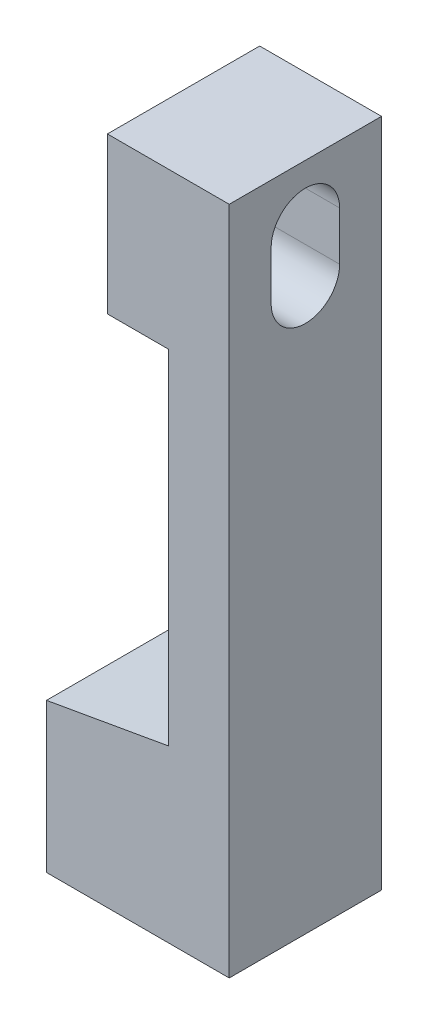
ISO-10303-21;
HEADER;
FILE_DESCRIPTION(('STEP AP214'),'2;1');
FILE_NAME('part.step','',(''),(''),'','','');
FILE_SCHEMA(('AUTOMOTIVE_DESIGN { 1 0 10303 214 1 1 1 1 }'));
ENDSEC;
DATA;
#1=APPLICATION_CONTEXT('core data for automotive mechanical design processes');
#2=APPLICATION_PROTOCOL_DEFINITION('international standard','automotive_design',2000,#1);
#3=PRODUCT_CONTEXT('',#1,'mechanical');
#4=PRODUCT('Part','Part','',(#3));
#5=PRODUCT_RELATED_PRODUCT_CATEGORY('part','',(#4));
#6=PRODUCT_DEFINITION_FORMATION('','',#4);
#7=PRODUCT_DEFINITION_CONTEXT('part definition',#1,'design');
#8=PRODUCT_DEFINITION('design','',#6,#7);
#9=PRODUCT_DEFINITION_SHAPE('','',#8);
#10=(LENGTH_UNIT() NAMED_UNIT(*) SI_UNIT(.MILLI.,.METRE.));
#11=(NAMED_UNIT(*) PLANE_ANGLE_UNIT() SI_UNIT($,.RADIAN.));
#12=(NAMED_UNIT(*) SI_UNIT($,.STERADIAN.) SOLID_ANGLE_UNIT());
#13=UNCERTAINTY_MEASURE_WITH_UNIT(LENGTH_MEASURE(1.E-05),#10,'distance_accuracy_value','');
#14=(GEOMETRIC_REPRESENTATION_CONTEXT(3) GLOBAL_UNCERTAINTY_ASSIGNED_CONTEXT((#13)) GLOBAL_UNIT_ASSIGNED_CONTEXT((#10,
#11,#12)) REPRESENTATION_CONTEXT('',''));
#15=CARTESIAN_POINT('',(0.,0.,0.));
#16=DIRECTION('',(0.,0.,1.));
#17=DIRECTION('',(1.,0.,0.));
#18=AXIS2_PLACEMENT_3D('',#15,#16,#17);
#19=CARTESIAN_POINT('',(0.,0.,0.));
#20=DIRECTION('',(1.,0.,0.));
#21=DIRECTION('',(0.,0.,-1.));
#22=AXIS2_PLACEMENT_3D('',#19,#20,#21);
#23=PLANE('',#22);
#24=DIRECTION('',(0.,0.173648177666927,0.984807753012208));
#25=VECTOR('',#24,1.);
#26=CARTESIAN_POINT('',(0.,15.875,-7.93750000000001));
#27=LINE('',#26,#25);
#28=CARTESIAN_POINT('',(0.,15.875,-7.9375));
#29=VERTEX_POINT('',#28);
#30=CARTESIAN_POINT('',(0.,18.6741908187468,7.93750000000001));
#31=VERTEX_POINT('',#30);
#32=EDGE_CURVE('E182',#29,#31,#27,.T.);
#33=ORIENTED_EDGE('',*,*,#32,.F.);
#34=DIRECTION('',(0.,1.,0.));
#35=VECTOR('',#34,1.);
#36=CARTESIAN_POINT('',(0.,34.925,-7.93749999999999));
#37=LINE('',#36,#35);
#38=CARTESIAN_POINT('',(0.,-19.9441908187469,-7.9375));
#39=VERTEX_POINT('',#38);
#40=EDGE_CURVE('E201',#39,#29,#37,.T.);
#41=ORIENTED_EDGE('',*,*,#40,.F.);
#42=DIRECTION('',(0.,-0.173648177666934,-0.984807753012207));
#43=VECTOR('',#42,1.);
#44=CARTESIAN_POINT('',(0.,-17.145,7.93750000000001));
#45=LINE('',#44,#43);
#46=CARTESIAN_POINT('',(0.,-17.145,7.93750000000001));
#47=VERTEX_POINT('',#46);
#48=EDGE_CURVE('E166',#47,#39,#45,.T.);
#49=ORIENTED_EDGE('',*,*,#48,.F.);
#50=DIRECTION('',(0.,-1.,0.));
#51=VECTOR('',#50,1.);
#52=CARTESIAN_POINT('',(0.,34.925,7.93750000000001));
#53=LINE('',#52,#51);
#54=EDGE_CURVE('E206',#31,#47,#53,.T.);
#55=ORIENTED_EDGE('',*,*,#54,.F.);
#56=EDGE_LOOP('',(#33,#41,#49,#55));
#57=FACE_BOUND('',#56,.T.);
#58=ADVANCED_FACE('F37',(#57),#23,.F.);
#59=CARTESIAN_POINT('',(6.35,34.925,-7.93749999999999));
#60=DIRECTION('',(0.,0.,1.));
#61=DIRECTION('',(0.,-1.,0.));
#62=AXIS2_PLACEMENT_3D('',#59,#60,#61);
#63=PLANE('',#62);
#64=DIRECTION('',(-1.,0.,0.));
#65=VECTOR('',#64,1.);
#66=CARTESIAN_POINT('',(6.35,-34.925,-7.9375));
#67=LINE('',#66,#65);
#68=CARTESIAN_POINT('',(6.35,-34.925,-7.9375));
#69=VERTEX_POINT('',#68);
#70=CARTESIAN_POINT('',(-12.7,-34.925,-7.9375));
#71=VERTEX_POINT('',#70);
#72=EDGE_CURVE('E212',#69,#71,#67,.T.);
#73=ORIENTED_EDGE('',*,*,#72,.T.);
#74=DIRECTION('',(0.,-1.,0.));
#75=VECTOR('',#74,1.);
#76=CARTESIAN_POINT('',(-12.7,-19.9441908187469,-7.9375));
#77=LINE('',#76,#75);
#78=CARTESIAN_POINT('',(-12.7,-19.9441908187469,-7.9375));
#79=VERTEX_POINT('',#78);
#80=EDGE_CURVE('E169',#79,#71,#77,.T.);
#81=ORIENTED_EDGE('',*,*,#80,.F.);
#82=DIRECTION('',(1.,0.,0.));
#83=VECTOR('',#82,1.);
#84=CARTESIAN_POINT('',(-12.7,-19.9441908187469,-7.9375));
#85=LINE('',#84,#83);
#86=EDGE_CURVE('E178',#79,#39,#85,.T.);
#87=ORIENTED_EDGE('',*,*,#86,.T.);
#88=ORIENTED_EDGE('',*,*,#40,.T.);
#89=DIRECTION('',(1.,0.,0.));
#90=VECTOR('',#89,1.);
#91=CARTESIAN_POINT('',(-6.35,15.875,-7.93750000000001));
#92=LINE('',#91,#90);
#93=CARTESIAN_POINT('',(-6.35,15.875,-7.93750000000001));
#94=VERTEX_POINT('',#93);
#95=EDGE_CURVE('E198',#94,#29,#92,.T.);
#96=ORIENTED_EDGE('',*,*,#95,.F.);
#97=DIRECTION('',(0.,-1.,0.));
#98=VECTOR('',#97,1.);
#99=CARTESIAN_POINT('',(-6.35,34.925,-7.9375));
#100=LINE('',#99,#98);
#101=CARTESIAN_POINT('',(-6.35,34.925,-7.9375));
#102=VERTEX_POINT('',#101);
#103=EDGE_CURVE('E189',#102,#94,#100,.T.);
#104=ORIENTED_EDGE('',*,*,#103,.F.);
#105=DIRECTION('',(-1.,0.,0.));
#106=VECTOR('',#105,1.);
#107=CARTESIAN_POINT('',(6.35,34.925,-7.93749999999999));
#108=LINE('',#107,#106);
#109=CARTESIAN_POINT('',(6.35,34.925,-7.93749999999999));
#110=VERTEX_POINT('',#109);
#111=EDGE_CURVE('E221',#110,#102,#108,.T.);
#112=ORIENTED_EDGE('',*,*,#111,.F.);
#113=DIRECTION('',(0.,1.,0.));
#114=VECTOR('',#113,1.);
#115=CARTESIAN_POINT('',(6.35,34.925,-7.93749999999999));
#116=LINE('',#115,#114);
#117=EDGE_CURVE('E202',#69,#110,#116,.T.);
#118=ORIENTED_EDGE('',*,*,#117,.F.);
#119=EDGE_LOOP('',(#73,#81,#87,#88,#96,#104,#112,#118));
#120=FACE_BOUND('',#119,.T.);
#121=ADVANCED_FACE('F39',(#120),#63,.F.);
#122=CARTESIAN_POINT('',(6.35,34.925,7.93750000000001));
#123=DIRECTION('',(0.,-1.,0.));
#124=DIRECTION('',(0.,0.,-1.));
#125=AXIS2_PLACEMENT_3D('',#122,#123,#124);
#126=PLANE('',#125);
#127=ORIENTED_EDGE('',*,*,#111,.T.);
#128=DIRECTION('',(0.,0.,-1.));
#129=VECTOR('',#128,1.);
#130=CARTESIAN_POINT('',(-6.35,34.925,7.93750000000001));
#131=LINE('',#130,#129);
#132=CARTESIAN_POINT('',(-6.35,34.925,7.93750000000001));
#133=VERTEX_POINT('',#132);
#134=EDGE_CURVE('E186',#133,#102,#131,.T.);
#135=ORIENTED_EDGE('',*,*,#134,.F.);
#136=DIRECTION('',(-1.,0.,0.));
#137=VECTOR('',#136,1.);
#138=CARTESIAN_POINT('',(6.35,34.925,7.93750000000001));
#139=LINE('',#138,#137);
#140=CARTESIAN_POINT('',(6.35,34.925,7.93750000000001));
#141=VERTEX_POINT('',#140);
#142=EDGE_CURVE('E219',#141,#133,#139,.T.);
#143=ORIENTED_EDGE('',*,*,#142,.F.);
#144=DIRECTION('',(0.,0.,1.));
#145=VECTOR('',#144,1.);
#146=CARTESIAN_POINT('',(6.35,34.925,7.93750000000001));
#147=LINE('',#146,#145);
#148=EDGE_CURVE('E205',#110,#141,#147,.T.);
#149=ORIENTED_EDGE('',*,*,#148,.F.);
#150=EDGE_LOOP('',(#127,#135,#143,#149));
#151=FACE_BOUND('',#150,.T.);
#152=ADVANCED_FACE('F251',(#151),#126,.F.);
#153=CARTESIAN_POINT('',(6.35,34.925,7.93750000000001));
#154=DIRECTION('',(0.,0.,-1.));
#155=DIRECTION('',(0.,1.,0.));
#156=AXIS2_PLACEMENT_3D('',#153,#154,#155);
#157=PLANE('',#156);
#158=ORIENTED_EDGE('',*,*,#54,.T.);
#159=DIRECTION('',(-0.984807753012209,-0.173648177666923,0.));
#160=VECTOR('',#159,1.);
#161=CARTESIAN_POINT('',(-12.7,-19.3843526549974,7.93750000000001));
#162=LINE('',#161,#160);
#163=CARTESIAN_POINT('',(-12.7,-19.3843526549974,7.93750000000001));
#164=VERTEX_POINT('',#163);
#165=EDGE_CURVE('E155',#47,#164,#162,.T.);
#166=ORIENTED_EDGE('',*,*,#165,.T.);
#167=DIRECTION('',(0.,1.,0.));
#168=VECTOR('',#167,1.);
#169=CARTESIAN_POINT('',(-12.7,-34.925,7.9375));
#170=LINE('',#169,#168);
#171=CARTESIAN_POINT('',(-12.7,-34.925,7.9375));
#172=VERTEX_POINT('',#171);
#173=EDGE_CURVE('E175',#172,#164,#170,.T.);
#174=ORIENTED_EDGE('',*,*,#173,.F.);
#175=DIRECTION('',(-1.,0.,0.));
#176=VECTOR('',#175,1.);
#177=CARTESIAN_POINT('',(6.35,-34.925,7.9375));
#178=LINE('',#177,#176);
#179=CARTESIAN_POINT('',(6.35,-34.925,7.9375));
#180=VERTEX_POINT('',#179);
#181=EDGE_CURVE('E217',#180,#172,#178,.T.);
#182=ORIENTED_EDGE('',*,*,#181,.F.);
#183=DIRECTION('',(0.,-1.,0.));
#184=VECTOR('',#183,1.);
#185=CARTESIAN_POINT('',(6.35,34.925,7.93750000000001));
#186=LINE('',#185,#184);
#187=EDGE_CURVE('E208',#141,#180,#186,.T.);
#188=ORIENTED_EDGE('',*,*,#187,.F.);
#189=ORIENTED_EDGE('',*,*,#142,.T.);
#190=DIRECTION('',(0.,1.,0.));
#191=VECTOR('',#190,1.);
#192=CARTESIAN_POINT('',(-6.35,34.925,7.93750000000001));
#193=LINE('',#192,#191);
#194=CARTESIAN_POINT('',(-6.35,18.6741908187468,7.93750000000001));
#195=VERTEX_POINT('',#194);
#196=EDGE_CURVE('E183',#195,#133,#193,.T.);
#197=ORIENTED_EDGE('',*,*,#196,.F.);
#198=DIRECTION('',(1.,0.,0.));
#199=VECTOR('',#198,1.);
#200=CARTESIAN_POINT('',(-6.35,18.6741908187468,7.93750000000001));
#201=LINE('',#200,#199);
#202=EDGE_CURVE('E193',#195,#31,#201,.T.);
#203=ORIENTED_EDGE('',*,*,#202,.T.);
#204=EDGE_LOOP('',(#158,#166,#174,#182,#188,#189,#197,#203));
#205=FACE_BOUND('',#204,.T.);
#206=ADVANCED_FACE('F260',(#205),#157,.F.);
#207=CARTESIAN_POINT('',(6.35,-34.925,7.9375));
#208=DIRECTION('',(0.,1.,0.));
#209=DIRECTION('',(0.,0.,1.));
#210=AXIS2_PLACEMENT_3D('',#207,#208,#209);
#211=PLANE('',#210);
#212=ORIENTED_EDGE('',*,*,#181,.T.);
#213=DIRECTION('',(0.,0.,1.));
#214=VECTOR('',#213,1.);
#215=CARTESIAN_POINT('',(-12.7,-34.925,-7.9375));
#216=LINE('',#215,#214);
#217=EDGE_CURVE('E172',#71,#172,#216,.T.);
#218=ORIENTED_EDGE('',*,*,#217,.F.);
#219=ORIENTED_EDGE('',*,*,#72,.F.);
#220=DIRECTION('',(0.,0.,-1.));
#221=VECTOR('',#220,1.);
#222=CARTESIAN_POINT('',(6.35,-34.925,7.9375));
#223=LINE('',#222,#221);
#224=EDGE_CURVE('E210',#180,#69,#223,.T.);
#225=ORIENTED_EDGE('',*,*,#224,.F.);
#226=EDGE_LOOP('',(#212,#218,#219,#225));
#227=FACE_BOUND('',#226,.T.);
#228=ADVANCED_FACE('F257',(#227),#211,.F.);
#229=CARTESIAN_POINT('',(6.35,0.,0.));
#230=DIRECTION('',(1.,0.,0.));
#231=DIRECTION('',(0.,0.,-1.));
#232=AXIS2_PLACEMENT_3D('',#229,#230,#231);
#233=PLANE('',#232);
#234=CARTESIAN_POINT('',(6.35,28.8417379890377,0.));
#235=DIRECTION('',(1.,0.,0.));
#236=DIRECTION('',(0.,0.,-1.));
#237=AXIS2_PLACEMENT_3D('',#234,#235,#236);
#238=CIRCLE('',#237,3.5687);
#239=CARTESIAN_POINT('',(6.35,28.8417379890377,-3.5687));
#240=VERTEX_POINT('',#239);
#241=CARTESIAN_POINT('',(6.35,28.8417379890377,3.5687));
#242=VERTEX_POINT('',#241);
#243=EDGE_CURVE('E52',#240,#242,#238,.T.);
#244=ORIENTED_EDGE('',*,*,#243,.F.);
#245=DIRECTION('',(0.,1.,0.));
#246=VECTOR('',#245,1.);
#247=CARTESIAN_POINT('',(6.35,28.8417379890377,-3.5687));
#248=LINE('',#247,#246);
#249=CARTESIAN_POINT('',(6.35,23.7617379890377,-3.5687));
#250=VERTEX_POINT('',#249);
#251=EDGE_CURVE('E148',#250,#240,#248,.T.);
#252=ORIENTED_EDGE('',*,*,#251,.F.);
#253=CARTESIAN_POINT('',(6.35,23.7617379890377,0.));
#254=DIRECTION('',(1.,0.,0.));
#255=DIRECTION('',(0.,0.,-1.));
#256=AXIS2_PLACEMENT_3D('',#253,#254,#255);
#257=CIRCLE('',#256,3.5687);
#258=CARTESIAN_POINT('',(6.35,23.7617379890377,3.5687));
#259=VERTEX_POINT('',#258);
#260=EDGE_CURVE('E132',#259,#250,#257,.T.);
#261=ORIENTED_EDGE('',*,*,#260,.F.);
#262=DIRECTION('',(0.,-1.,0.));
#263=VECTOR('',#262,1.);
#264=CARTESIAN_POINT('',(6.35,28.8417379890377,3.5687));
#265=LINE('',#264,#263);
#266=EDGE_CURVE('E141',#242,#259,#265,.T.);
#267=ORIENTED_EDGE('',*,*,#266,.F.);
#268=EDGE_LOOP('',(#244,#252,#261,#267));
#269=FACE_BOUND('',#268,.T.);
#270=ORIENTED_EDGE('',*,*,#117,.T.);
#271=ORIENTED_EDGE('',*,*,#148,.T.);
#272=ORIENTED_EDGE('',*,*,#187,.T.);
#273=ORIENTED_EDGE('',*,*,#224,.T.);
#274=EDGE_LOOP('',(#270,#271,#272,#273));
#275=FACE_BOUND('',#274,.T.);
#276=ADVANCED_FACE('F145',(#269,#275),#233,.T.);
#277=CARTESIAN_POINT('',(-6.35,15.875,-7.93750000000001));
#278=DIRECTION('',(0.,0.984807753012209,-0.173648177666927));
#279=DIRECTION('',(0.,0.173648177666927,0.984807753012209));
#280=AXIS2_PLACEMENT_3D('',#277,#278,#279);
#281=PLANE('',#280);
#282=ORIENTED_EDGE('',*,*,#32,.T.);
#283=ORIENTED_EDGE('',*,*,#202,.F.);
#284=DIRECTION('',(0.,0.173648177666927,0.984807753012208));
#285=VECTOR('',#284,1.);
#286=CARTESIAN_POINT('',(-6.35,15.875,-7.93750000000001));
#287=LINE('',#286,#285);
#288=EDGE_CURVE('E191',#94,#195,#287,.T.);
#289=ORIENTED_EDGE('',*,*,#288,.F.);
#290=ORIENTED_EDGE('',*,*,#95,.T.);
#291=EDGE_LOOP('',(#282,#283,#289,#290));
#292=FACE_BOUND('',#291,.T.);
#293=ADVANCED_FACE('F279',(#292),#281,.F.);
#294=CARTESIAN_POINT('',(-6.35,0.,0.));
#295=DIRECTION('',(1.,0.,0.));
#296=DIRECTION('',(0.,0.,-1.));
#297=AXIS2_PLACEMENT_3D('',#294,#295,#296);
#298=PLANE('',#297);
#299=DIRECTION('',(0.,1.,0.));
#300=VECTOR('',#299,1.);
#301=CARTESIAN_POINT('',(-6.35,0.,-3.56870000000001));
#302=LINE('',#301,#300);
#303=CARTESIAN_POINT('',(-6.35,23.7617379890377,-3.5687));
#304=VERTEX_POINT('',#303);
#305=CARTESIAN_POINT('',(-6.35,28.8417379890377,-3.5687));
#306=VERTEX_POINT('',#305);
#307=EDGE_CURVE('E45',#304,#306,#302,.T.);
#308=ORIENTED_EDGE('',*,*,#307,.T.);
#309=CARTESIAN_POINT('',(-6.35,28.8417379890377,0.));
#310=DIRECTION('',(1.,0.,0.));
#311=DIRECTION('',(0.,0.,-1.));
#312=AXIS2_PLACEMENT_3D('',#309,#310,#311);
#313=CIRCLE('',#312,3.5687);
#314=CARTESIAN_POINT('',(-6.35,28.8417379890377,3.5687));
#315=VERTEX_POINT('',#314);
#316=EDGE_CURVE('E11',#306,#315,#313,.T.);
#317=ORIENTED_EDGE('',*,*,#316,.T.);
#318=DIRECTION('',(0.,-1.,0.));
#319=VECTOR('',#318,1.);
#320=CARTESIAN_POINT('',(-6.35,0.,3.56869999999999));
#321=LINE('',#320,#319);
#322=CARTESIAN_POINT('',(-6.35,23.7617379890377,3.5687));
#323=VERTEX_POINT('',#322);
#324=EDGE_CURVE('E223',#315,#323,#321,.T.);
#325=ORIENTED_EDGE('',*,*,#324,.T.);
#326=CARTESIAN_POINT('',(-6.35,23.7617379890377,0.));
#327=DIRECTION('',(1.,0.,0.));
#328=DIRECTION('',(0.,0.,-1.));
#329=AXIS2_PLACEMENT_3D('',#326,#327,#328);
#330=CIRCLE('',#329,3.5687);
#331=EDGE_CURVE('E135',#323,#304,#330,.T.);
#332=ORIENTED_EDGE('',*,*,#331,.T.);
#333=EDGE_LOOP('',(#308,#317,#325,#332));
#334=FACE_BOUND('',#333,.T.);
#335=ORIENTED_EDGE('',*,*,#196,.T.);
#336=ORIENTED_EDGE('',*,*,#134,.T.);
#337=ORIENTED_EDGE('',*,*,#103,.T.);
#338=ORIENTED_EDGE('',*,*,#288,.T.);
#339=EDGE_LOOP('',(#335,#336,#337,#338));
#340=FACE_BOUND('',#339,.T.);
#341=ADVANCED_FACE('F227',(#334,#340),#298,.F.);
#342=CARTESIAN_POINT('',(-12.7,-17.145,7.93750000000001));
#343=DIRECTION('',(0.,-0.984807753012207,0.173648177666934));
#344=DIRECTION('',(0.,-0.173648177666934,-0.984807753012208));
#345=AXIS2_PLACEMENT_3D('',#342,#343,#344);
#346=PLANE('',#345);
#347=DIRECTION('',(0.,-0.173648177666934,-0.984807753012207));
#348=VECTOR('',#347,1.);
#349=CARTESIAN_POINT('',(-12.7,-17.145,7.93750000000001));
#350=LINE('',#349,#348);
#351=CARTESIAN_POINT('',(-12.7,-19.3843526549974,-4.76249999999936));
#352=VERTEX_POINT('',#351);
#353=EDGE_CURVE('E167',#352,#79,#350,.T.);
#354=ORIENTED_EDGE('',*,*,#353,.F.);
#355=DIRECTION('',(0.701673843159885,0.123724030206482,0.701673843159842));
#356=VECTOR('',#355,1.);
#357=CARTESIAN_POINT('',(-6.25279651361947,-18.2475367302309,1.68470348638089));
#358=LINE('',#357,#356);
#359=EDGE_CURVE('E163',#352,#47,#358,.T.);
#360=ORIENTED_EDGE('',*,*,#359,.T.);
#361=ORIENTED_EDGE('',*,*,#48,.T.);
#362=ORIENTED_EDGE('',*,*,#86,.F.);
#363=EDGE_LOOP('',(#354,#360,#361,#362));
#364=FACE_BOUND('',#363,.T.);
#365=ADVANCED_FACE('F291',(#364),#346,.F.);
#366=CARTESIAN_POINT('',(-12.7,0.,0.));
#367=DIRECTION('',(-1.,0.,0.));
#368=DIRECTION('',(0.,0.,1.));
#369=AXIS2_PLACEMENT_3D('',#366,#367,#368);
#370=PLANE('',#369);
#371=DIRECTION('',(0.,0.,-1.));
#372=VECTOR('',#371,1.);
#373=CARTESIAN_POINT('',(-12.7,-19.3843526549974,7.93750000000001));
#374=LINE('',#373,#372);
#375=EDGE_CURVE('E160',#164,#352,#374,.T.);
#376=ORIENTED_EDGE('',*,*,#375,.T.);
#377=ORIENTED_EDGE('',*,*,#353,.T.);
#378=ORIENTED_EDGE('',*,*,#80,.T.);
#379=ORIENTED_EDGE('',*,*,#217,.T.);
#380=ORIENTED_EDGE('',*,*,#173,.T.);
#381=EDGE_LOOP('',(#376,#377,#378,#379,#380));
#382=FACE_BOUND('',#381,.T.);
#383=ADVANCED_FACE('F241',(#382),#370,.T.);
#384=CARTESIAN_POINT('',(-12.7,-19.3843526549974,7.93750000000001));
#385=DIRECTION('',(0.173648177666924,-0.984807753012209,0.));
#386=DIRECTION('',(0.984807753012209,0.173648177666924,0.));
#387=AXIS2_PLACEMENT_3D('',#384,#385,#386);
#388=PLANE('',#387);
#389=ORIENTED_EDGE('',*,*,#375,.F.);
#390=ORIENTED_EDGE('',*,*,#165,.F.);
#391=ORIENTED_EDGE('',*,*,#359,.F.);
#392=EDGE_LOOP('',(#389,#390,#391));
#393=FACE_BOUND('',#392,.T.);
#394=ADVANCED_FACE('F234',(#393),#388,.F.);
#395=CARTESIAN_POINT('',(-12.7,28.8417379890377,0.));
#396=DIRECTION('',(1.,0.,0.));
#397=DIRECTION('',(0.,0.,-1.));
#398=AXIS2_PLACEMENT_3D('',#395,#396,#397);
#399=CYLINDRICAL_SURFACE('',#398,3.5687);
#400=DIRECTION('',(1.,0.,0.));
#401=VECTOR('',#400,1.);
#402=CARTESIAN_POINT('',(-12.7,28.8417379890377,-3.5687));
#403=LINE('',#402,#401);
#404=EDGE_CURVE('E153',#306,#240,#403,.T.);
#405=ORIENTED_EDGE('',*,*,#404,.T.);
#406=ORIENTED_EDGE('',*,*,#243,.T.);
#407=DIRECTION('',(1.,0.,0.));
#408=VECTOR('',#407,1.);
#409=CARTESIAN_POINT('',(-12.7,28.8417379890377,3.5687));
#410=LINE('',#409,#408);
#411=EDGE_CURVE('E138',#315,#242,#410,.T.);
#412=ORIENTED_EDGE('',*,*,#411,.F.);
#413=ORIENTED_EDGE('',*,*,#316,.F.);
#414=EDGE_LOOP('',(#405,#406,#412,#413));
#415=FACE_BOUND('',#414,.T.);
#416=ADVANCED_FACE('F232',(#415),#399,.F.);
#417=CARTESIAN_POINT('',(-12.7,28.8417379890377,-3.5687));
#418=DIRECTION('',(0.,0.,-1.));
#419=DIRECTION('',(0.,1.,0.));
#420=AXIS2_PLACEMENT_3D('',#417,#418,#419);
#421=PLANE('',#420);
#422=DIRECTION('',(1.,0.,0.));
#423=VECTOR('',#422,1.);
#424=CARTESIAN_POINT('',(-12.7,23.7617379890377,-3.5687));
#425=LINE('',#424,#423);
#426=EDGE_CURVE('E137',#304,#250,#425,.T.);
#427=ORIENTED_EDGE('',*,*,#426,.T.);
#428=ORIENTED_EDGE('',*,*,#251,.T.);
#429=ORIENTED_EDGE('',*,*,#404,.F.);
#430=ORIENTED_EDGE('',*,*,#307,.F.);
#431=EDGE_LOOP('',(#427,#428,#429,#430));
#432=FACE_BOUND('',#431,.T.);
#433=ADVANCED_FACE('F231',(#432),#421,.F.);
#434=CARTESIAN_POINT('',(-12.7,23.7617379890377,0.));
#435=DIRECTION('',(1.,0.,0.));
#436=DIRECTION('',(0.,0.,-1.));
#437=AXIS2_PLACEMENT_3D('',#434,#435,#436);
#438=CYLINDRICAL_SURFACE('',#437,3.5687);
#439=DIRECTION('',(1.,0.,0.));
#440=VECTOR('',#439,1.);
#441=CARTESIAN_POINT('',(-12.7,23.7617379890377,3.5687));
#442=LINE('',#441,#440);
#443=EDGE_CURVE('E60',#323,#259,#442,.T.);
#444=ORIENTED_EDGE('',*,*,#443,.T.);
#445=ORIENTED_EDGE('',*,*,#260,.T.);
#446=ORIENTED_EDGE('',*,*,#426,.F.);
#447=ORIENTED_EDGE('',*,*,#331,.F.);
#448=EDGE_LOOP('',(#444,#445,#446,#447));
#449=FACE_BOUND('',#448,.T.);
#450=ADVANCED_FACE('F129',(#449),#438,.F.);
#451=CARTESIAN_POINT('',(-12.7,28.8417379890377,3.5687));
#452=DIRECTION('',(0.,0.,1.));
#453=DIRECTION('',(0.,-1.,0.));
#454=AXIS2_PLACEMENT_3D('',#451,#452,#453);
#455=PLANE('',#454);
#456=ORIENTED_EDGE('',*,*,#411,.T.);
#457=ORIENTED_EDGE('',*,*,#266,.T.);
#458=ORIENTED_EDGE('',*,*,#443,.F.);
#459=ORIENTED_EDGE('',*,*,#324,.F.);
#460=EDGE_LOOP('',(#456,#457,#458,#459));
#461=FACE_BOUND('',#460,.T.);
#462=ADVANCED_FACE('F142',(#461),#455,.F.);
#463=CLOSED_SHELL('',(#58,#121,#152,#206,#228,#276,#293,#341,#365,#383,#394,#416,#433,#450,#462));
#464=MANIFOLD_SOLID_BREP('B2',#463);
#465=ADVANCED_BREP_SHAPE_REPRESENTATION('',(#18,#464),#14);
#466=SHAPE_DEFINITION_REPRESENTATION(#9,#465);
ENDSEC;
END-ISO-10303-21;
